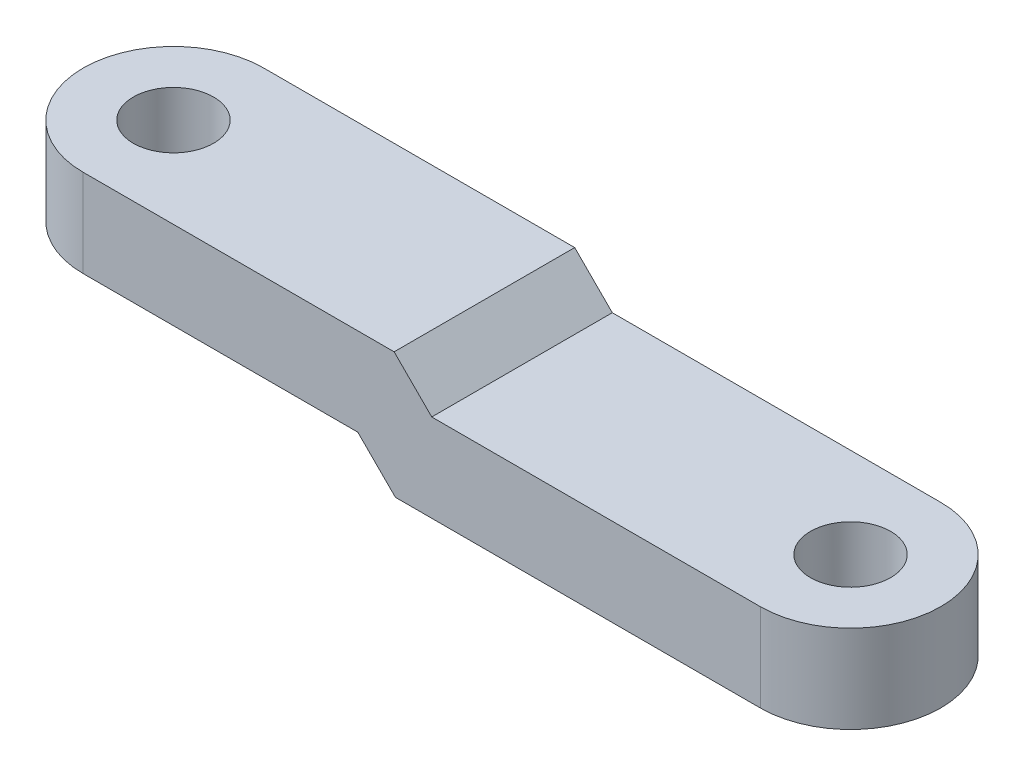
ISO-10303-21;
HEADER;
FILE_DESCRIPTION(('STEP AP214'),'2;1');
FILE_NAME('part.step','',(''),(''),'','','');
FILE_SCHEMA(('AUTOMOTIVE_DESIGN { 1 0 10303 214 1 1 1 1 }'));
ENDSEC;
DATA;
#1=APPLICATION_CONTEXT('core data for automotive mechanical design processes');
#2=APPLICATION_PROTOCOL_DEFINITION('international standard','automotive_design',2000,#1);
#3=PRODUCT_CONTEXT('',#1,'mechanical');
#4=PRODUCT('Part','Part','',(#3));
#5=PRODUCT_RELATED_PRODUCT_CATEGORY('part','',(#4));
#6=PRODUCT_DEFINITION_FORMATION('','',#4);
#7=PRODUCT_DEFINITION_CONTEXT('part definition',#1,'design');
#8=PRODUCT_DEFINITION('design','',#6,#7);
#9=PRODUCT_DEFINITION_SHAPE('','',#8);
#10=(LENGTH_UNIT() NAMED_UNIT(*) SI_UNIT(.MILLI.,.METRE.));
#11=(NAMED_UNIT(*) PLANE_ANGLE_UNIT() SI_UNIT($,.RADIAN.));
#12=(NAMED_UNIT(*) SI_UNIT($,.STERADIAN.) SOLID_ANGLE_UNIT());
#13=UNCERTAINTY_MEASURE_WITH_UNIT(LENGTH_MEASURE(1.E-05),#10,'distance_accuracy_value','');
#14=(GEOMETRIC_REPRESENTATION_CONTEXT(3) GLOBAL_UNCERTAINTY_ASSIGNED_CONTEXT((#13)) GLOBAL_UNIT_ASSIGNED_CONTEXT((#10,
#11,#12)) REPRESENTATION_CONTEXT('',''));
#15=CARTESIAN_POINT('',(0.,0.,0.));
#16=DIRECTION('',(0.,0.,1.));
#17=DIRECTION('',(1.,0.,0.));
#18=AXIS2_PLACEMENT_3D('',#15,#16,#17);
#19=CARTESIAN_POINT('',(-27.,5.,0.));
#20=DIRECTION('',(0.,1.,0.));
#21=DIRECTION('',(0.,0.,1.));
#22=AXIS2_PLACEMENT_3D('',#19,#20,#21);
#23=PLANE('',#22);
#24=DIRECTION('',(0.,0.,1.));
#25=VECTOR('',#24,1.);
#26=CARTESIAN_POINT('',(-14.6,5.,-3.6));
#27=LINE('',#26,#25);
#28=CARTESIAN_POINT('',(-14.6,5.,-3.6));
#29=VERTEX_POINT('',#28);
#30=CARTESIAN_POINT('',(-14.6,5.,3.6));
#31=VERTEX_POINT('',#30);
#32=EDGE_CURVE('E124',#29,#31,#27,.T.);
#33=ORIENTED_EDGE('',*,*,#32,.F.);
#34=DIRECTION('',(-1.,0.,0.));
#35=VECTOR('',#34,1.);
#36=CARTESIAN_POINT('',(-27.,5.,-3.6));
#37=LINE('',#36,#35);
#38=CARTESIAN_POINT('',(-27.,5.,-3.6));
#39=VERTEX_POINT('',#38);
#40=EDGE_CURVE('E156',#29,#39,#37,.T.);
#41=ORIENTED_EDGE('',*,*,#40,.T.);
#42=CARTESIAN_POINT('',(-27.,5.,0.));
#43=DIRECTION('',(0.,1.,0.));
#44=DIRECTION('',(0.,0.,1.));
#45=AXIS2_PLACEMENT_3D('',#42,#43,#44);
#46=CIRCLE('',#45,3.6);
#47=CARTESIAN_POINT('',(-27.,5.,3.6));
#48=VERTEX_POINT('',#47);
#49=EDGE_CURVE('E150',#39,#48,#46,.T.);
#50=ORIENTED_EDGE('',*,*,#49,.T.);
#51=DIRECTION('',(1.,0.,0.));
#52=VECTOR('',#51,1.);
#53=CARTESIAN_POINT('',(-27.,5.,3.6));
#54=LINE('',#53,#52);
#55=EDGE_CURVE('E153',#48,#31,#54,.T.);
#56=ORIENTED_EDGE('',*,*,#55,.T.);
#57=EDGE_LOOP('',(#33,#41,#50,#56));
#58=FACE_BOUND('',#57,.T.);
#59=CARTESIAN_POINT('',(-27.,5.,0.));
#60=DIRECTION('',(0.,1.,0.));
#61=DIRECTION('',(0.,0.,1.));
#62=AXIS2_PLACEMENT_3D('',#59,#60,#61);
#63=CIRCLE('',#62,1.6);
#64=CARTESIAN_POINT('',(-27.,5.,1.6));
#65=VERTEX_POINT('',#64);
#66=EDGE_CURVE('E143',#65,#65,#63,.T.);
#67=ORIENTED_EDGE('',*,*,#66,.F.);
#68=EDGE_LOOP('',(#67));
#69=FACE_BOUND('',#68,.T.);
#70=ADVANCED_FACE('F32',(#58,#69),#23,.T.);
#71=CARTESIAN_POINT('',(-27.,0.,0.));
#72=DIRECTION('',(0.,1.,0.));
#73=DIRECTION('',(0.,0.,1.));
#74=AXIS2_PLACEMENT_3D('',#71,#72,#73);
#75=PLANE('',#74);
#76=DIRECTION('',(1.,0.,0.));
#77=VECTOR('',#76,1.);
#78=CARTESIAN_POINT('',(-27.,0.,3.6));
#79=LINE('',#78,#77);
#80=CARTESIAN_POINT('',(-14.5497474683058,0.,3.6));
#81=VERTEX_POINT('',#80);
#82=CARTESIAN_POINT('',(0.,0.,3.6));
#83=VERTEX_POINT('',#82);
#84=EDGE_CURVE('E149',#81,#83,#79,.T.);
#85=ORIENTED_EDGE('',*,*,#84,.F.);
#86=DIRECTION('',(0.,0.,1.));
#87=VECTOR('',#86,1.);
#88=CARTESIAN_POINT('',(-14.5497474683058,0.,-3.6));
#89=LINE('',#88,#87);
#90=CARTESIAN_POINT('',(-14.5497474683058,0.,-3.6));
#91=VERTEX_POINT('',#90);
#92=EDGE_CURVE('E108',#91,#81,#89,.T.);
#93=ORIENTED_EDGE('',*,*,#92,.F.);
#94=DIRECTION('',(-1.,0.,0.));
#95=VECTOR('',#94,1.);
#96=CARTESIAN_POINT('',(-27.,0.,-3.6));
#97=LINE('',#96,#95);
#98=CARTESIAN_POINT('',(0.,0.,-3.6));
#99=VERTEX_POINT('',#98);
#100=EDGE_CURVE('E119',#99,#91,#97,.T.);
#101=ORIENTED_EDGE('',*,*,#100,.F.);
#102=CARTESIAN_POINT('',(0.,0.,0.));
#103=DIRECTION('',(0.,1.,0.));
#104=DIRECTION('',(0.,0.,1.));
#105=AXIS2_PLACEMENT_3D('',#102,#103,#104);
#106=CIRCLE('',#105,3.6);
#107=EDGE_CURVE('E160',#83,#99,#106,.T.);
#108=ORIENTED_EDGE('',*,*,#107,.F.);
#109=EDGE_LOOP('',(#85,#93,#101,#108));
#110=FACE_BOUND('',#109,.T.);
#111=CARTESIAN_POINT('',(0.,0.,0.));
#112=DIRECTION('',(0.,1.,0.));
#113=DIRECTION('',(0.,0.,1.));
#114=AXIS2_PLACEMENT_3D('',#111,#112,#113);
#115=CIRCLE('',#114,1.6);
#116=CARTESIAN_POINT('',(0.,0.,1.6));
#117=VERTEX_POINT('',#116);
#118=EDGE_CURVE('E146',#117,#117,#115,.T.);
#119=ORIENTED_EDGE('',*,*,#118,.T.);
#120=EDGE_LOOP('',(#119));
#121=FACE_BOUND('',#120,.T.);
#122=ADVANCED_FACE('F180',(#110,#121),#75,.F.);
#123=CARTESIAN_POINT('',(-27.,5.,0.));
#124=DIRECTION('',(0.,-1.,0.));
#125=DIRECTION('',(0.,0.,-1.));
#126=AXIS2_PLACEMENT_3D('',#123,#124,#125);
#127=CYLINDRICAL_SURFACE('',#126,3.6);
#128=CARTESIAN_POINT('',(-27.,1.5,0.));
#129=DIRECTION('',(0.,1.,0.));
#130=DIRECTION('',(-1.,0.,0.));
#131=AXIS2_PLACEMENT_3D('',#128,#129,#130);
#132=CIRCLE('',#131,3.6);
#133=CARTESIAN_POINT('',(-27.,1.5,-3.6));
#134=VERTEX_POINT('',#133);
#135=CARTESIAN_POINT('',(-27.,1.5,3.6));
#136=VERTEX_POINT('',#135);
#137=EDGE_CURVE('E57',#134,#136,#132,.T.);
#138=ORIENTED_EDGE('',*,*,#137,.T.);
#139=DIRECTION('',(0.,-1.,0.));
#140=VECTOR('',#139,1.);
#141=CARTESIAN_POINT('',(-27.,5.,3.6));
#142=LINE('',#141,#140);
#143=EDGE_CURVE('E11',#48,#136,#142,.T.);
#144=ORIENTED_EDGE('',*,*,#143,.F.);
#145=ORIENTED_EDGE('',*,*,#49,.F.);
#146=DIRECTION('',(0.,-1.,0.));
#147=VECTOR('',#146,1.);
#148=CARTESIAN_POINT('',(-27.,5.,-3.6));
#149=LINE('',#148,#147);
#150=EDGE_CURVE('E158',#39,#134,#149,.T.);
#151=ORIENTED_EDGE('',*,*,#150,.T.);
#152=EDGE_LOOP('',(#138,#144,#145,#151));
#153=FACE_BOUND('',#152,.T.);
#154=ADVANCED_FACE('F34',(#153),#127,.T.);
#155=CARTESIAN_POINT('',(-27.,5.,3.6));
#156=DIRECTION('',(0.,0.,-1.));
#157=DIRECTION('',(-1.,0.,0.));
#158=AXIS2_PLACEMENT_3D('',#155,#156,#157);
#159=PLANE('',#158);
#160=DIRECTION('',(-1.,0.,0.));
#161=VECTOR('',#160,1.);
#162=CARTESIAN_POINT('',(0.,1.50000000000001,3.6));
#163=LINE('',#162,#161);
#164=CARTESIAN_POINT('',(-16.0497474683058,1.5,3.6));
#165=VERTEX_POINT('',#164);
#166=EDGE_CURVE('E120',#165,#136,#163,.T.);
#167=ORIENTED_EDGE('',*,*,#166,.F.);
#168=DIRECTION('',(-0.707106781186547,0.707106781186548,0.));
#169=VECTOR('',#168,1.);
#170=CARTESIAN_POINT('',(-7.27487373415293,-7.27487373415292,3.6));
#171=LINE('',#170,#169);
#172=EDGE_CURVE('E106',#81,#165,#171,.T.);
#173=ORIENTED_EDGE('',*,*,#172,.F.);
#174=ORIENTED_EDGE('',*,*,#84,.T.);
#175=DIRECTION('',(0.,-1.,0.));
#176=VECTOR('',#175,1.);
#177=CARTESIAN_POINT('',(0.,5.,3.6));
#178=LINE('',#177,#176);
#179=CARTESIAN_POINT('',(0.,3.5,3.6));
#180=VERTEX_POINT('',#179);
#181=EDGE_CURVE('E41',#180,#83,#178,.T.);
#182=ORIENTED_EDGE('',*,*,#181,.F.);
#183=DIRECTION('',(1.,0.,0.));
#184=VECTOR('',#183,1.);
#185=CARTESIAN_POINT('',(0.,3.5,3.6));
#186=LINE('',#185,#184);
#187=CARTESIAN_POINT('',(-13.1,3.5,3.6));
#188=VERTEX_POINT('',#187);
#189=EDGE_CURVE('E132',#188,#180,#186,.T.);
#190=ORIENTED_EDGE('',*,*,#189,.F.);
#191=DIRECTION('',(0.707106781186547,-0.707106781186549,0.));
#192=VECTOR('',#191,1.);
#193=CARTESIAN_POINT('',(-4.80000000000002,-4.80000000000001,3.6));
#194=LINE('',#193,#192);
#195=EDGE_CURVE('E135',#31,#188,#194,.T.);
#196=ORIENTED_EDGE('',*,*,#195,.F.);
#197=ORIENTED_EDGE('',*,*,#55,.F.);
#198=ORIENTED_EDGE('',*,*,#143,.T.);
#199=EDGE_LOOP('',(#167,#173,#174,#182,#190,#196,#197,#198));
#200=FACE_BOUND('',#199,.T.);
#201=ADVANCED_FACE('F195',(#200),#159,.F.);
#202=CARTESIAN_POINT('',(0.,5.,0.));
#203=DIRECTION('',(0.,-1.,0.));
#204=DIRECTION('',(0.,0.,-1.));
#205=AXIS2_PLACEMENT_3D('',#202,#203,#204);
#206=CYLINDRICAL_SURFACE('',#205,3.6);
#207=DIRECTION('',(0.,-1.,0.));
#208=VECTOR('',#207,1.);
#209=CARTESIAN_POINT('',(0.,5.,-3.6));
#210=LINE('',#209,#208);
#211=CARTESIAN_POINT('',(0.,3.5,-3.6));
#212=VERTEX_POINT('',#211);
#213=EDGE_CURVE('E165',#212,#99,#210,.T.);
#214=ORIENTED_EDGE('',*,*,#213,.F.);
#215=CARTESIAN_POINT('',(0.,3.5,0.));
#216=DIRECTION('',(0.,-1.,0.));
#217=DIRECTION('',(0.,0.,-1.));
#218=AXIS2_PLACEMENT_3D('',#215,#216,#217);
#219=CIRCLE('',#218,3.6);
#220=EDGE_CURVE('E49',#212,#180,#219,.T.);
#221=ORIENTED_EDGE('',*,*,#220,.T.);
#222=ORIENTED_EDGE('',*,*,#181,.T.);
#223=ORIENTED_EDGE('',*,*,#107,.T.);
#224=EDGE_LOOP('',(#214,#221,#222,#223));
#225=FACE_BOUND('',#224,.T.);
#226=ADVANCED_FACE('F193',(#225),#206,.T.);
#227=CARTESIAN_POINT('',(-27.,5.,-3.6));
#228=DIRECTION('',(0.,0.,1.));
#229=DIRECTION('',(1.,0.,0.));
#230=AXIS2_PLACEMENT_3D('',#227,#228,#229);
#231=PLANE('',#230);
#232=ORIENTED_EDGE('',*,*,#100,.T.);
#233=DIRECTION('',(-0.707106781186547,0.707106781186548,0.));
#234=VECTOR('',#233,1.);
#235=CARTESIAN_POINT('',(-7.27487373415293,-7.27487373415292,-3.6));
#236=LINE('',#235,#234);
#237=CARTESIAN_POINT('',(-16.0497474683058,1.5,-3.6));
#238=VERTEX_POINT('',#237);
#239=EDGE_CURVE('E103',#91,#238,#236,.T.);
#240=ORIENTED_EDGE('',*,*,#239,.T.);
#241=DIRECTION('',(-1.,0.,0.));
#242=VECTOR('',#241,1.);
#243=CARTESIAN_POINT('',(0.,1.50000000000001,-3.6));
#244=LINE('',#243,#242);
#245=EDGE_CURVE('E109',#238,#134,#244,.T.);
#246=ORIENTED_EDGE('',*,*,#245,.T.);
#247=ORIENTED_EDGE('',*,*,#150,.F.);
#248=ORIENTED_EDGE('',*,*,#40,.F.);
#249=DIRECTION('',(0.707106781186547,-0.707106781186549,0.));
#250=VECTOR('',#249,1.);
#251=CARTESIAN_POINT('',(-4.80000000000002,-4.80000000000001,-3.6));
#252=LINE('',#251,#250);
#253=CARTESIAN_POINT('',(-13.1,3.5,-3.6));
#254=VERTEX_POINT('',#253);
#255=EDGE_CURVE('E128',#29,#254,#252,.T.);
#256=ORIENTED_EDGE('',*,*,#255,.T.);
#257=DIRECTION('',(1.,0.,0.));
#258=VECTOR('',#257,1.);
#259=CARTESIAN_POINT('',(0.,3.5,-3.6));
#260=LINE('',#259,#258);
#261=EDGE_CURVE('E131',#254,#212,#260,.T.);
#262=ORIENTED_EDGE('',*,*,#261,.T.);
#263=ORIENTED_EDGE('',*,*,#213,.T.);
#264=EDGE_LOOP('',(#232,#240,#246,#247,#248,#256,#262,#263));
#265=FACE_BOUND('',#264,.T.);
#266=ADVANCED_FACE('F117',(#265),#231,.F.);
#267=CARTESIAN_POINT('',(0.,5.,0.));
#268=DIRECTION('',(0.,-1.,0.));
#269=DIRECTION('',(0.,0.,-1.));
#270=AXIS2_PLACEMENT_3D('',#267,#268,#269);
#271=CYLINDRICAL_SURFACE('',#270,1.6);
#272=CARTESIAN_POINT('',(0.,3.5,0.));
#273=DIRECTION('',(0.,-1.,0.));
#274=DIRECTION('',(0.,0.,-1.));
#275=AXIS2_PLACEMENT_3D('',#272,#273,#274);
#276=CIRCLE('',#275,1.6);
#277=CARTESIAN_POINT('',(0.,3.5,-1.6));
#278=VERTEX_POINT('',#277);
#279=EDGE_CURVE('E36',#278,#278,#276,.T.);
#280=ORIENTED_EDGE('',*,*,#279,.F.);
#281=EDGE_LOOP('',(#280));
#282=FACE_BOUND('',#281,.T.);
#283=ORIENTED_EDGE('',*,*,#118,.F.);
#284=EDGE_LOOP('',(#283));
#285=FACE_BOUND('',#284,.T.);
#286=ADVANCED_FACE('F175',(#282,#285),#271,.F.);
#287=CARTESIAN_POINT('',(-27.,5.,0.));
#288=DIRECTION('',(0.,-1.,0.));
#289=DIRECTION('',(0.,0.,-1.));
#290=AXIS2_PLACEMENT_3D('',#287,#288,#289);
#291=CYLINDRICAL_SURFACE('',#290,1.6);
#292=CARTESIAN_POINT('',(-27.,1.5,0.));
#293=DIRECTION('',(0.,1.,0.));
#294=DIRECTION('',(-1.,0.,0.));
#295=AXIS2_PLACEMENT_3D('',#292,#293,#294);
#296=CIRCLE('',#295,1.6);
#297=CARTESIAN_POINT('',(-28.6,1.5,0.));
#298=VERTEX_POINT('',#297);
#299=EDGE_CURVE('E126',#298,#298,#296,.T.);
#300=ORIENTED_EDGE('',*,*,#299,.F.);
#301=EDGE_LOOP('',(#300));
#302=FACE_BOUND('',#301,.T.);
#303=ORIENTED_EDGE('',*,*,#66,.T.);
#304=EDGE_LOOP('',(#303));
#305=FACE_BOUND('',#304,.T.);
#306=ADVANCED_FACE('F172',(#302,#305),#291,.F.);
#307=CARTESIAN_POINT('',(0.,1.50000000000001,-3.6));
#308=DIRECTION('',(0.,1.,0.));
#309=DIRECTION('',(-1.,0.,0.));
#310=AXIS2_PLACEMENT_3D('',#307,#308,#309);
#311=PLANE('',#310);
#312=ORIENTED_EDGE('',*,*,#299,.T.);
#313=EDGE_LOOP('',(#312));
#314=FACE_BOUND('',#313,.T.);
#315=ORIENTED_EDGE('',*,*,#137,.F.);
#316=ORIENTED_EDGE('',*,*,#245,.F.);
#317=DIRECTION('',(0.,0.,1.));
#318=VECTOR('',#317,1.);
#319=CARTESIAN_POINT('',(-16.0497474683058,1.5,-3.6));
#320=LINE('',#319,#318);
#321=EDGE_CURVE('E100',#238,#165,#320,.T.);
#322=ORIENTED_EDGE('',*,*,#321,.T.);
#323=ORIENTED_EDGE('',*,*,#166,.T.);
#324=EDGE_LOOP('',(#315,#316,#322,#323));
#325=FACE_BOUND('',#324,.T.);
#326=ADVANCED_FACE('F111',(#314,#325),#311,.F.);
#327=CARTESIAN_POINT('',(-7.27487373415293,-7.27487373415292,-3.6));
#328=DIRECTION('',(0.707106781186548,0.707106781186547,0.));
#329=DIRECTION('',(-0.707106781186547,0.707106781186548,0.));
#330=AXIS2_PLACEMENT_3D('',#327,#328,#329);
#331=PLANE('',#330);
#332=ORIENTED_EDGE('',*,*,#172,.T.);
#333=ORIENTED_EDGE('',*,*,#321,.F.);
#334=ORIENTED_EDGE('',*,*,#239,.F.);
#335=ORIENTED_EDGE('',*,*,#92,.T.);
#336=EDGE_LOOP('',(#332,#333,#334,#335));
#337=FACE_BOUND('',#336,.T.);
#338=ADVANCED_FACE('F101',(#337),#331,.F.);
#339=CARTESIAN_POINT('',(0.,3.5,-3.6));
#340=DIRECTION('',(0.,-1.,0.));
#341=DIRECTION('',(0.,0.,-1.));
#342=AXIS2_PLACEMENT_3D('',#339,#340,#341);
#343=PLANE('',#342);
#344=ORIENTED_EDGE('',*,*,#279,.T.);
#345=EDGE_LOOP('',(#344));
#346=FACE_BOUND('',#345,.T.);
#347=ORIENTED_EDGE('',*,*,#261,.F.);
#348=DIRECTION('',(0.,0.,1.));
#349=VECTOR('',#348,1.);
#350=CARTESIAN_POINT('',(-13.1,3.5,-3.6));
#351=LINE('',#350,#349);
#352=EDGE_CURVE('E134',#254,#188,#351,.T.);
#353=ORIENTED_EDGE('',*,*,#352,.T.);
#354=ORIENTED_EDGE('',*,*,#189,.T.);
#355=ORIENTED_EDGE('',*,*,#220,.F.);
#356=EDGE_LOOP('',(#347,#353,#354,#355));
#357=FACE_BOUND('',#356,.T.);
#358=ADVANCED_FACE('F212',(#346,#357),#343,.F.);
#359=CARTESIAN_POINT('',(-4.80000000000002,-4.80000000000001,-3.6));
#360=DIRECTION('',(-0.707106781186549,-0.707106781186547,0.));
#361=DIRECTION('',(0.707106781186547,-0.707106781186549,0.));
#362=AXIS2_PLACEMENT_3D('',#359,#360,#361);
#363=PLANE('',#362);
#364=ORIENTED_EDGE('',*,*,#195,.T.);
#365=ORIENTED_EDGE('',*,*,#352,.F.);
#366=ORIENTED_EDGE('',*,*,#255,.F.);
#367=ORIENTED_EDGE('',*,*,#32,.T.);
#368=EDGE_LOOP('',(#364,#365,#366,#367));
#369=FACE_BOUND('',#368,.T.);
#370=ADVANCED_FACE('F209',(#369),#363,.F.);
#371=CLOSED_SHELL('',(#70,#122,#154,#201,#226,#266,#286,#306,#326,#338,#358,#370));
#372=MANIFOLD_SOLID_BREP('B2',#371);
#373=ADVANCED_BREP_SHAPE_REPRESENTATION('',(#18,#372),#14);
#374=SHAPE_DEFINITION_REPRESENTATION(#9,#373);
ENDSEC;
END-ISO-10303-21;
